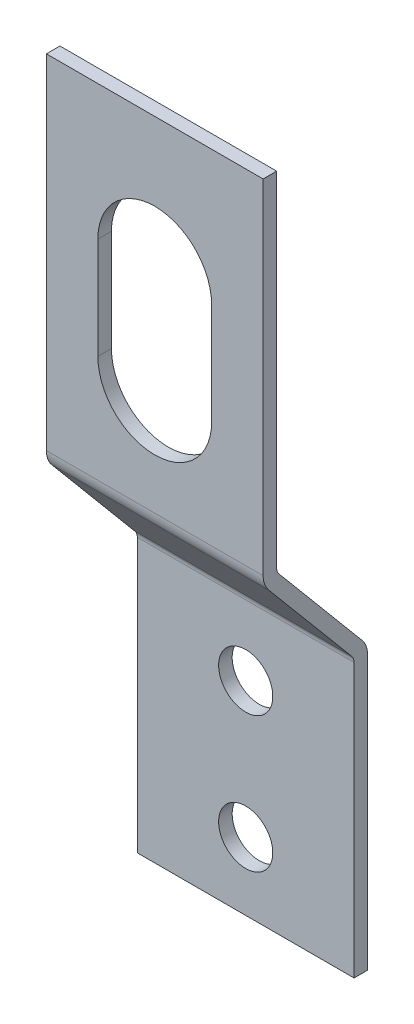
ISO-10303-21;
HEADER;
FILE_DESCRIPTION(('STEP AP214'),'2;1');
FILE_NAME('part.step','',(''),(''),'','','');
FILE_SCHEMA(('AUTOMOTIVE_DESIGN { 1 0 10303 214 1 1 1 1 }'));
ENDSEC;
DATA;
#1=APPLICATION_CONTEXT('core data for automotive mechanical design processes');
#2=APPLICATION_PROTOCOL_DEFINITION('international standard','automotive_design',2000,#1);
#3=PRODUCT_CONTEXT('',#1,'mechanical');
#4=PRODUCT('Part','Part','',(#3));
#5=PRODUCT_RELATED_PRODUCT_CATEGORY('part','',(#4));
#6=PRODUCT_DEFINITION_FORMATION('','',#4);
#7=PRODUCT_DEFINITION_CONTEXT('part definition',#1,'design');
#8=PRODUCT_DEFINITION('design','',#6,#7);
#9=PRODUCT_DEFINITION_SHAPE('','',#8);
#10=(LENGTH_UNIT() NAMED_UNIT(*) SI_UNIT(.MILLI.,.METRE.));
#11=(NAMED_UNIT(*) PLANE_ANGLE_UNIT() SI_UNIT($,.RADIAN.));
#12=(NAMED_UNIT(*) SI_UNIT($,.STERADIAN.) SOLID_ANGLE_UNIT());
#13=UNCERTAINTY_MEASURE_WITH_UNIT(LENGTH_MEASURE(1.E-05),#10,'distance_accuracy_value','');
#14=(GEOMETRIC_REPRESENTATION_CONTEXT(3) GLOBAL_UNCERTAINTY_ASSIGNED_CONTEXT((#13)) GLOBAL_UNIT_ASSIGNED_CONTEXT((#10,
#11,#12)) REPRESENTATION_CONTEXT('',''));
#15=CARTESIAN_POINT('',(0.,0.,0.));
#16=DIRECTION('',(0.,0.,1.));
#17=DIRECTION('',(1.,0.,0.));
#18=AXIS2_PLACEMENT_3D('',#15,#16,#17);
#19=CARTESIAN_POINT('',(0.,-1.19175359259422,6.71345131623842));
#20=DIRECTION('',(0.,0.,-1.));
#21=DIRECTION('',(-1.,0.,0.));
#22=AXIS2_PLACEMENT_3D('',#19,#20,#21);
#23=PLANE('',#22);
#24=DIRECTION('',(0.,-1.,0.));
#25=VECTOR('',#24,1.);
#26=CARTESIAN_POINT('',(8.,54.4450558979731,6.71345131623842));
#27=LINE('',#26,#25);
#28=CARTESIAN_POINT('',(8.,29.0771266067998,6.71345131623842));
#29=VERTEX_POINT('',#28);
#30=CARTESIAN_POINT('',(8.,54.4450558979731,6.71345131623842));
#31=VERTEX_POINT('',#30);
#32=EDGE_CURVE('E153',#29,#31,#27,.F.);
#33=ORIENTED_EDGE('',*,*,#32,.T.);
#34=DIRECTION('',(1.,0.,0.));
#35=VECTOR('',#34,1.);
#36=CARTESIAN_POINT('',(-8.,54.4450558979731,6.71345131623842));
#37=LINE('',#36,#35);
#38=CARTESIAN_POINT('',(-8.,54.4450558979731,6.71345131623842));
#39=VERTEX_POINT('',#38);
#40=EDGE_CURVE('E163',#31,#39,#37,.F.);
#41=ORIENTED_EDGE('',*,*,#40,.T.);
#42=DIRECTION('',(0.,1.,0.));
#43=VECTOR('',#42,1.);
#44=CARTESIAN_POINT('',(-8.,28.8090261322393,6.71345131623842));
#45=LINE('',#44,#43);
#46=CARTESIAN_POINT('',(-8.,29.0771266067998,6.71345131623842));
#47=VERTEX_POINT('',#46);
#48=EDGE_CURVE('E155',#39,#47,#45,.F.);
#49=ORIENTED_EDGE('',*,*,#48,.T.);
#50=DIRECTION('',(1.,0.,0.));
#51=VECTOR('',#50,1.);
#52=CARTESIAN_POINT('',(8.00000000000001,29.0771266067998,6.71345131623842));
#53=LINE('',#52,#51);
#54=EDGE_CURVE('E219',#29,#47,#53,.F.);
#55=ORIENTED_EDGE('',*,*,#54,.F.);
#56=EDGE_LOOP('',(#33,#41,#49,#55));
#57=FACE_BOUND('',#56,.T.);
#58=CARTESIAN_POINT('',(0.,44.5,6.71345131623842));
#59=DIRECTION('',(0.,0.,-1.));
#60=DIRECTION('',(-1.,0.,0.));
#61=AXIS2_PLACEMENT_3D('',#58,#59,#60);
#62=CIRCLE('',#61,4.2);
#63=CARTESIAN_POINT('',(-4.2,44.5,6.71345131623842));
#64=VERTEX_POINT('',#63);
#65=CARTESIAN_POINT('',(4.2,44.5,6.71345131623842));
#66=VERTEX_POINT('',#65);
#67=EDGE_CURVE('E20',#64,#66,#62,.T.);
#68=ORIENTED_EDGE('',*,*,#67,.T.);
#69=DIRECTION('',(0.,1.,0.));
#70=VECTOR('',#69,1.);
#71=CARTESIAN_POINT('',(4.2,44.5,6.71345131623842));
#72=LINE('',#71,#70);
#73=CARTESIAN_POINT('',(4.2,37.,6.71345131623842));
#74=VERTEX_POINT('',#73);
#75=EDGE_CURVE('E168',#66,#74,#72,.F.);
#76=ORIENTED_EDGE('',*,*,#75,.T.);
#77=CARTESIAN_POINT('',(0.,37.,6.71345131623842));
#78=DIRECTION('',(0.,0.,-1.));
#79=DIRECTION('',(-1.,0.,0.));
#80=AXIS2_PLACEMENT_3D('',#77,#78,#79);
#81=CIRCLE('',#80,4.2);
#82=CARTESIAN_POINT('',(-4.2,37.,6.71345131623842));
#83=VERTEX_POINT('',#82);
#84=EDGE_CURVE('E132',#74,#83,#81,.T.);
#85=ORIENTED_EDGE('',*,*,#84,.T.);
#86=DIRECTION('',(0.,-1.,0.));
#87=VECTOR('',#86,1.);
#88=CARTESIAN_POINT('',(-4.2,44.5,6.71345131623842));
#89=LINE('',#88,#87);
#90=EDGE_CURVE('E128',#83,#64,#89,.F.);
#91=ORIENTED_EDGE('',*,*,#90,.T.);
#92=EDGE_LOOP('',(#68,#76,#85,#91));
#93=FACE_BOUND('',#92,.T.);
#94=ADVANCED_FACE('F17',(#57,#93),#23,.F.);
#95=CARTESIAN_POINT('',(0.,44.5,6.71345131623842));
#96=DIRECTION('',(0.,0.,-1.));
#97=DIRECTION('',(-1.,0.,0.));
#98=AXIS2_PLACEMENT_3D('',#95,#96,#97);
#99=CYLINDRICAL_SURFACE('',#98,4.2);
#100=DIRECTION('',(0.,0.,1.));
#101=VECTOR('',#100,1.);
#102=CARTESIAN_POINT('',(4.2,44.5,6.71345131623842));
#103=LINE('',#102,#101);
#104=CARTESIAN_POINT('',(4.2,44.5,5.71345131623842));
#105=VERTEX_POINT('',#104);
#106=EDGE_CURVE('E142',#105,#66,#103,.T.);
#107=ORIENTED_EDGE('',*,*,#106,.T.);
#108=ORIENTED_EDGE('',*,*,#67,.F.);
#109=DIRECTION('',(0.,0.,1.));
#110=VECTOR('',#109,1.);
#111=CARTESIAN_POINT('',(-4.2,44.5,6.71345131623842));
#112=LINE('',#111,#110);
#113=CARTESIAN_POINT('',(-4.2,44.5,5.71345131623842));
#114=VERTEX_POINT('',#113);
#115=EDGE_CURVE('E136',#64,#114,#112,.F.);
#116=ORIENTED_EDGE('',*,*,#115,.T.);
#117=CARTESIAN_POINT('',(0.,44.5,5.71345131623842));
#118=DIRECTION('',(0.,0.,-1.));
#119=DIRECTION('',(-1.,0.,0.));
#120=AXIS2_PLACEMENT_3D('',#117,#118,#119);
#121=CIRCLE('',#120,4.2);
#122=EDGE_CURVE('E215',#105,#114,#121,.F.);
#123=ORIENTED_EDGE('',*,*,#122,.F.);
#124=EDGE_LOOP('',(#107,#108,#116,#123));
#125=FACE_BOUND('',#124,.T.);
#126=ADVANCED_FACE('F139',(#125),#99,.F.);
#127=CARTESIAN_POINT('',(-4.2,44.5,6.71345131623842));
#128=DIRECTION('',(-1.,0.,0.));
#129=DIRECTION('',(0.,-1.,0.));
#130=AXIS2_PLACEMENT_3D('',#127,#128,#129);
#131=PLANE('',#130);
#132=ORIENTED_EDGE('',*,*,#115,.F.);
#133=ORIENTED_EDGE('',*,*,#90,.F.);
#134=DIRECTION('',(0.,0.,-1.));
#135=VECTOR('',#134,1.);
#136=CARTESIAN_POINT('',(-4.2,37.,6.71345131623842));
#137=LINE('',#136,#135);
#138=CARTESIAN_POINT('',(-4.2,37.,5.71345131623842));
#139=VERTEX_POINT('',#138);
#140=EDGE_CURVE('E149',#83,#139,#137,.T.);
#141=ORIENTED_EDGE('',*,*,#140,.T.);
#142=DIRECTION('',(0.,1.,0.));
#143=VECTOR('',#142,1.);
#144=CARTESIAN_POINT('',(-4.2,-1.19175359259422,5.71345131623842));
#145=LINE('',#144,#143);
#146=EDGE_CURVE('E146',#114,#139,#145,.F.);
#147=ORIENTED_EDGE('',*,*,#146,.F.);
#148=EDGE_LOOP('',(#132,#133,#141,#147));
#149=FACE_BOUND('',#148,.T.);
#150=ADVANCED_FACE('F144',(#149),#131,.F.);
#151=CARTESIAN_POINT('',(0.,37.,6.71345131623842));
#152=DIRECTION('',(0.,0.,-1.));
#153=DIRECTION('',(-1.,0.,0.));
#154=AXIS2_PLACEMENT_3D('',#151,#152,#153);
#155=CYLINDRICAL_SURFACE('',#154,4.2);
#156=ORIENTED_EDGE('',*,*,#140,.F.);
#157=ORIENTED_EDGE('',*,*,#84,.F.);
#158=DIRECTION('',(0.,0.,1.));
#159=VECTOR('',#158,1.);
#160=CARTESIAN_POINT('',(4.2,37.,6.71345131623842));
#161=LINE('',#160,#159);
#162=CARTESIAN_POINT('',(4.2,37.,5.71345131623842));
#163=VERTEX_POINT('',#162);
#164=EDGE_CURVE('E156',#74,#163,#161,.F.);
#165=ORIENTED_EDGE('',*,*,#164,.T.);
#166=CARTESIAN_POINT('',(0.,37.,5.71345131623842));
#167=DIRECTION('',(0.,0.,-1.));
#168=DIRECTION('',(-1.,0.,0.));
#169=AXIS2_PLACEMENT_3D('',#166,#167,#168);
#170=CIRCLE('',#169,4.2);
#171=EDGE_CURVE('E211',#139,#163,#170,.F.);
#172=ORIENTED_EDGE('',*,*,#171,.F.);
#173=EDGE_LOOP('',(#156,#157,#165,#172));
#174=FACE_BOUND('',#173,.T.);
#175=ADVANCED_FACE('F242',(#174),#155,.F.);
#176=CARTESIAN_POINT('',(4.2,44.5,6.71345131623842));
#177=DIRECTION('',(1.,0.,0.));
#178=DIRECTION('',(0.,1.,0.));
#179=AXIS2_PLACEMENT_3D('',#176,#177,#178);
#180=PLANE('',#179);
#181=ORIENTED_EDGE('',*,*,#164,.F.);
#182=ORIENTED_EDGE('',*,*,#75,.F.);
#183=ORIENTED_EDGE('',*,*,#106,.F.);
#184=DIRECTION('',(0.,1.,0.));
#185=VECTOR('',#184,1.);
#186=CARTESIAN_POINT('',(4.2,-1.19175359259422,5.71345131623842));
#187=LINE('',#186,#185);
#188=EDGE_CURVE('E214',#163,#105,#187,.T.);
#189=ORIENTED_EDGE('',*,*,#188,.F.);
#190=EDGE_LOOP('',(#181,#182,#183,#189));
#191=FACE_BOUND('',#190,.T.);
#192=ADVANCED_FACE('F464',(#191),#180,.F.);
#193=CARTESIAN_POINT('',(-8.,54.4450558979731,6.71345131623842));
#194=DIRECTION('',(0.,-1.,0.));
#195=DIRECTION('',(0.,0.,-1.));
#196=AXIS2_PLACEMENT_3D('',#193,#194,#195);
#197=PLANE('',#196);
#198=DIRECTION('',(0.,0.,-1.));
#199=VECTOR('',#198,1.);
#200=CARTESIAN_POINT('',(-8.,54.4450558979731,6.71345131623842));
#201=LINE('',#200,#199);
#202=CARTESIAN_POINT('',(-8.,54.4450558979731,5.71345131623842));
#203=VERTEX_POINT('',#202);
#204=EDGE_CURVE('E165',#39,#203,#201,.T.);
#205=ORIENTED_EDGE('',*,*,#204,.F.);
#206=ORIENTED_EDGE('',*,*,#40,.F.);
#207=DIRECTION('',(0.,0.,-1.));
#208=VECTOR('',#207,1.);
#209=CARTESIAN_POINT('',(8.,54.4450558979731,6.71345131623842));
#210=LINE('',#209,#208);
#211=CARTESIAN_POINT('',(8.,54.4450558979731,5.71345131623842));
#212=VERTEX_POINT('',#211);
#213=EDGE_CURVE('E160',#212,#31,#210,.F.);
#214=ORIENTED_EDGE('',*,*,#213,.F.);
#215=DIRECTION('',(-1.,0.,0.));
#216=VECTOR('',#215,1.);
#217=CARTESIAN_POINT('',(0.,54.4450558979731,5.71345131623842));
#218=LINE('',#217,#216);
#219=EDGE_CURVE('E210',#203,#212,#218,.F.);
#220=ORIENTED_EDGE('',*,*,#219,.F.);
#221=EDGE_LOOP('',(#205,#206,#214,#220));
#222=FACE_BOUND('',#221,.T.);
#223=ADVANCED_FACE('F290',(#222),#197,.F.);
#224=CARTESIAN_POINT('',(8.00000000000001,29.0771266067998,4.97685131623841));
#225=DIRECTION('',(1.,0.,0.));
#226=DIRECTION('',(0.,0.,-1.));
#227=AXIS2_PLACEMENT_3D('',#224,#225,#226);
#228=CYLINDRICAL_SURFACE('',#227,1.7366);
#229=ORIENTED_EDGE('',*,*,#54,.T.);
#230=CARTESIAN_POINT('',(-8.,29.0771266067998,4.97685131623841));
#231=DIRECTION('',(1.,0.,0.));
#232=DIRECTION('',(0.,0.,-1.));
#233=AXIS2_PLACEMENT_3D('',#230,#231,#232);
#234=CIRCLE('',#233,1.7366);
#235=CARTESIAN_POINT('',(-8.,27.9608616438182,6.30716409615884));
#236=VERTEX_POINT('',#235);
#237=EDGE_CURVE('E206',#236,#47,#234,.F.);
#238=ORIENTED_EDGE('',*,*,#237,.F.);
#239=DIRECTION('',(1.,0.,0.));
#240=VECTOR('',#239,1.);
#241=CARTESIAN_POINT('',(0.,27.9608616438182,6.30716409615885));
#242=LINE('',#241,#240);
#243=CARTESIAN_POINT('',(8.,27.9608616438182,6.30716409615884));
#244=VERTEX_POINT('',#243);
#245=EDGE_CURVE('E209',#244,#236,#242,.F.);
#246=ORIENTED_EDGE('',*,*,#245,.F.);
#247=CARTESIAN_POINT('',(8.,29.0771266067998,4.97685131623841));
#248=DIRECTION('',(1.,0.,0.));
#249=DIRECTION('',(0.,0.,-1.));
#250=AXIS2_PLACEMENT_3D('',#247,#248,#249);
#251=CIRCLE('',#250,1.7366);
#252=EDGE_CURVE('E217',#244,#29,#251,.F.);
#253=ORIENTED_EDGE('',*,*,#252,.T.);
#254=EDGE_LOOP('',(#229,#238,#246,#253));
#255=FACE_BOUND('',#254,.T.);
#256=ADVANCED_FACE('F447',(#255),#228,.T.);
#257=CARTESIAN_POINT('',(0.,-1.19175359259422,5.71345131623842));
#258=DIRECTION('',(0.,0.,-1.));
#259=DIRECTION('',(-1.,0.,0.));
#260=AXIS2_PLACEMENT_3D('',#257,#258,#259);
#261=PLANE('',#260);
#262=DIRECTION('',(0.,1.,0.));
#263=VECTOR('',#262,1.);
#264=CARTESIAN_POINT('',(-8.,-1.19175359259422,5.71345131623842));
#265=LINE('',#264,#263);
#266=CARTESIAN_POINT('',(-8.,29.0771266067998,5.71345131623842));
#267=VERTEX_POINT('',#266);
#268=EDGE_CURVE('E231',#267,#203,#265,.T.);
#269=ORIENTED_EDGE('',*,*,#268,.T.);
#270=ORIENTED_EDGE('',*,*,#219,.T.);
#271=DIRECTION('',(0.,1.,0.));
#272=VECTOR('',#271,1.);
#273=CARTESIAN_POINT('',(8.,-1.19175359259422,5.71345131623842));
#274=LINE('',#273,#272);
#275=CARTESIAN_POINT('',(8.,29.0771266067998,5.71345131623842));
#276=VERTEX_POINT('',#275);
#277=EDGE_CURVE('E254',#212,#276,#274,.F.);
#278=ORIENTED_EDGE('',*,*,#277,.T.);
#279=DIRECTION('',(1.,0.,0.));
#280=VECTOR('',#279,1.);
#281=CARTESIAN_POINT('',(8.00000000000001,29.0771266067998,5.71345131623842));
#282=LINE('',#281,#280);
#283=EDGE_CURVE('E202',#276,#267,#282,.F.);
#284=ORIENTED_EDGE('',*,*,#283,.T.);
#285=EDGE_LOOP('',(#269,#270,#278,#284));
#286=FACE_BOUND('',#285,.T.);
#287=ORIENTED_EDGE('',*,*,#171,.T.);
#288=ORIENTED_EDGE('',*,*,#188,.T.);
#289=ORIENTED_EDGE('',*,*,#122,.T.);
#290=ORIENTED_EDGE('',*,*,#146,.T.);
#291=EDGE_LOOP('',(#287,#288,#289,#290));
#292=FACE_BOUND('',#291,.T.);
#293=ADVANCED_FACE('F247',(#286,#292),#261,.T.);
#294=CARTESIAN_POINT('',(0.,7.53414621880322,-10.8328852831343));
#295=DIRECTION('',(0.,-0.642787609686535,0.766044443118982));
#296=DIRECTION('',(0.,-0.766044443118982,-0.642787609686535));
#297=AXIS2_PLACEMENT_3D('',#294,#295,#296);
#298=PLANE('',#297);
#299=DIRECTION('',(0.,-0.766044443118982,-0.642787609686535));
#300=VECTOR('',#299,1.);
#301=CARTESIAN_POINT('',(-8.,27.9608616438182,6.30716409615884));
#302=LINE('',#301,#300);
#303=CARTESIAN_POINT('',(-8.,20.6496530518742,0.172331663198554));
#304=VERTEX_POINT('',#303);
#305=EDGE_CURVE('E261',#236,#304,#302,.T.);
#306=ORIENTED_EDGE('',*,*,#305,.T.);
#307=DIRECTION('',(-1.,0.,0.));
#308=VECTOR('',#307,1.);
#309=CARTESIAN_POINT('',(-8.,20.6496530518742,0.172331663198554));
#310=LINE('',#309,#308);
#311=CARTESIAN_POINT('',(8.,20.6496530518742,0.172331663198554));
#312=VERTEX_POINT('',#311);
#313=EDGE_CURVE('E199',#304,#312,#310,.F.);
#314=ORIENTED_EDGE('',*,*,#313,.T.);
#315=DIRECTION('',(0.,0.766044443118982,0.642787609686534));
#316=VECTOR('',#315,1.);
#317=CARTESIAN_POINT('',(8.,20.6496530518742,0.172331663198555));
#318=LINE('',#317,#316);
#319=EDGE_CURVE('E205',#312,#244,#318,.T.);
#320=ORIENTED_EDGE('',*,*,#319,.T.);
#321=ORIENTED_EDGE('',*,*,#245,.T.);
#322=EDGE_LOOP('',(#306,#314,#320,#321));
#323=FACE_BOUND('',#322,.T.);
#324=ADVANCED_FACE('F317',(#323),#298,.T.);
#325=CARTESIAN_POINT('',(8.00000000000001,29.0771266067998,4.97685131623841));
#326=DIRECTION('',(1.,0.,0.));
#327=DIRECTION('',(0.,0.,-1.));
#328=AXIS2_PLACEMENT_3D('',#325,#326,#327);
#329=CYLINDRICAL_SURFACE('',#328,0.736600000000001);
#330=CARTESIAN_POINT('',(-8.,29.0771266067998,4.97685131623841));
#331=DIRECTION('',(1.,0.,0.));
#332=DIRECTION('',(0.,0.,-1.));
#333=AXIS2_PLACEMENT_3D('',#330,#331,#332);
#334=CIRCLE('',#333,0.736600000000001);
#335=CARTESIAN_POINT('',(-8.,28.6036492535047,5.54111965303987));
#336=VERTEX_POINT('',#335);
#337=EDGE_CURVE('E200',#267,#336,#334,.T.);
#338=ORIENTED_EDGE('',*,*,#337,.F.);
#339=ORIENTED_EDGE('',*,*,#283,.F.);
#340=CARTESIAN_POINT('',(8.,29.0771266067998,4.97685131623841));
#341=DIRECTION('',(1.,0.,0.));
#342=DIRECTION('',(0.,0.,-1.));
#343=AXIS2_PLACEMENT_3D('',#340,#341,#342);
#344=CIRCLE('',#343,0.736600000000001);
#345=CARTESIAN_POINT('',(8.,28.6036492535047,5.54111965303986));
#346=VERTEX_POINT('',#345);
#347=EDGE_CURVE('E203',#346,#276,#344,.F.);
#348=ORIENTED_EDGE('',*,*,#347,.F.);
#349=DIRECTION('',(1.,0.,0.));
#350=VECTOR('',#349,1.);
#351=CARTESIAN_POINT('',(0.,28.6036492535047,5.54111965303987));
#352=LINE('',#351,#350);
#353=EDGE_CURVE('E195',#346,#336,#352,.F.);
#354=ORIENTED_EDGE('',*,*,#353,.T.);
#355=EDGE_LOOP('',(#338,#339,#348,#354));
#356=FACE_BOUND('',#355,.T.);
#357=ADVANCED_FACE('F278',(#356),#329,.F.);
#358=CARTESIAN_POINT('',(-8.,20.1761756985791,0.736599999999996));
#359=DIRECTION('',(-1.,0.,0.));
#360=DIRECTION('',(0.,0.,1.));
#361=AXIS2_PLACEMENT_3D('',#358,#359,#360);
#362=CYLINDRICAL_SURFACE('',#361,0.736599999999999);
#363=CARTESIAN_POINT('',(8.,20.1761756985791,0.736599999999996));
#364=DIRECTION('',(-1.,0.,0.));
#365=DIRECTION('',(0.,0.,1.));
#366=AXIS2_PLACEMENT_3D('',#363,#364,#365);
#367=CIRCLE('',#366,0.736599999999999);
#368=CARTESIAN_POINT('',(8.,20.1761756985791,0.));
#369=VERTEX_POINT('',#368);
#370=EDGE_CURVE('E192',#312,#369,#367,.T.);
#371=ORIENTED_EDGE('',*,*,#370,.F.);
#372=ORIENTED_EDGE('',*,*,#313,.F.);
#373=CARTESIAN_POINT('',(-8.,20.1761756985791,0.736599999999996));
#374=DIRECTION('',(-1.,0.,0.));
#375=DIRECTION('',(0.,0.,1.));
#376=AXIS2_PLACEMENT_3D('',#373,#374,#375);
#377=CIRCLE('',#376,0.736599999999999);
#378=CARTESIAN_POINT('',(-8.,20.1761756985791,0.));
#379=VERTEX_POINT('',#378);
#380=EDGE_CURVE('E196',#304,#379,#377,.T.);
#381=ORIENTED_EDGE('',*,*,#380,.T.);
#382=DIRECTION('',(-1.,0.,0.));
#383=VECTOR('',#382,1.);
#384=CARTESIAN_POINT('',(0.,20.1761756985791,0.));
#385=LINE('',#384,#383);
#386=EDGE_CURVE('E191',#379,#369,#385,.F.);
#387=ORIENTED_EDGE('',*,*,#386,.T.);
#388=EDGE_LOOP('',(#371,#372,#381,#387));
#389=FACE_BOUND('',#388,.T.);
#390=ADVANCED_FACE('F328',(#389),#362,.F.);
#391=CARTESIAN_POINT('',(0.,8.17693382848976,-11.5989297262533));
#392=DIRECTION('',(0.,-0.642787609686535,0.766044443118982));
#393=DIRECTION('',(0.,-0.766044443118982,-0.642787609686535));
#394=AXIS2_PLACEMENT_3D('',#391,#392,#393);
#395=PLANE('',#394);
#396=DIRECTION('',(0.,-0.766044443118982,-0.642787609686535));
#397=VECTOR('',#396,1.);
#398=CARTESIAN_POINT('',(8.,8.17693382848976,-11.5989297262533));
#399=LINE('',#398,#397);
#400=CARTESIAN_POINT('',(8.,21.2924406615607,-0.593712779920426));
#401=VERTEX_POINT('',#400);
#402=EDGE_CURVE('E293',#401,#346,#399,.F.);
#403=ORIENTED_EDGE('',*,*,#402,.F.);
#404=DIRECTION('',(-1.,0.,0.));
#405=VECTOR('',#404,1.);
#406=CARTESIAN_POINT('',(-8.,21.2924406615607,-0.593712779920429));
#407=LINE('',#406,#405);
#408=CARTESIAN_POINT('',(-8.,21.2924406615607,-0.593712779920428));
#409=VERTEX_POINT('',#408);
#410=EDGE_CURVE('E180',#409,#401,#407,.F.);
#411=ORIENTED_EDGE('',*,*,#410,.F.);
#412=DIRECTION('',(0.,-0.766044443118982,-0.642787609686535));
#413=VECTOR('',#412,1.);
#414=CARTESIAN_POINT('',(-8.00000000000001,8.17693382848976,-11.5989297262533));
#415=LINE('',#414,#413);
#416=EDGE_CURVE('E198',#336,#409,#415,.T.);
#417=ORIENTED_EDGE('',*,*,#416,.F.);
#418=ORIENTED_EDGE('',*,*,#353,.F.);
#419=EDGE_LOOP('',(#403,#411,#417,#418));
#420=FACE_BOUND('',#419,.T.);
#421=ADVANCED_FACE('F295',(#420),#395,.F.);
#422=CARTESIAN_POINT('',(0.,0.,0.));
#423=DIRECTION('',(0.,0.,-1.));
#424=DIRECTION('',(-1.,0.,0.));
#425=AXIS2_PLACEMENT_3D('',#422,#423,#424);
#426=PLANE('',#425);
#427=DIRECTION('',(0.,-1.,0.));
#428=VECTOR('',#427,1.);
#429=CARTESIAN_POINT('',(-8.,0.,0.));
#430=LINE('',#429,#428);
#431=CARTESIAN_POINT('',(-8.,0.,0.));
#432=VERTEX_POINT('',#431);
#433=EDGE_CURVE('E184',#432,#379,#430,.F.);
#434=ORIENTED_EDGE('',*,*,#433,.F.);
#435=DIRECTION('',(1.,0.,0.));
#436=VECTOR('',#435,1.);
#437=CARTESIAN_POINT('',(-8.,0.,0.));
#438=LINE('',#437,#436);
#439=CARTESIAN_POINT('',(8.,0.,0.));
#440=VERTEX_POINT('',#439);
#441=EDGE_CURVE('E311',#440,#432,#438,.F.);
#442=ORIENTED_EDGE('',*,*,#441,.F.);
#443=DIRECTION('',(0.,1.,0.));
#444=VECTOR('',#443,1.);
#445=CARTESIAN_POINT('',(8.,0.,0.));
#446=LINE('',#445,#444);
#447=EDGE_CURVE('E179',#369,#440,#446,.F.);
#448=ORIENTED_EDGE('',*,*,#447,.F.);
#449=ORIENTED_EDGE('',*,*,#386,.F.);
#450=EDGE_LOOP('',(#434,#442,#448,#449));
#451=FACE_BOUND('',#450,.T.);
#452=CARTESIAN_POINT('',(0.,5.,0.));
#453=DIRECTION('',(0.,0.,-1.));
#454=DIRECTION('',(-1.,0.,0.));
#455=AXIS2_PLACEMENT_3D('',#452,#453,#454);
#456=CIRCLE('',#455,2.);
#457=CARTESIAN_POINT('',(-2.,5.,0.));
#458=VERTEX_POINT('',#457);
#459=EDGE_CURVE('E185',#458,#458,#456,.T.);
#460=ORIENTED_EDGE('',*,*,#459,.T.);
#461=EDGE_LOOP('',(#460));
#462=FACE_BOUND('',#461,.T.);
#463=CARTESIAN_POINT('',(0.,15.,0.));
#464=DIRECTION('',(0.,0.,-1.));
#465=DIRECTION('',(-1.,0.,0.));
#466=AXIS2_PLACEMENT_3D('',#463,#464,#465);
#467=CIRCLE('',#466,2.);
#468=CARTESIAN_POINT('',(-2.,15.,0.));
#469=VERTEX_POINT('',#468);
#470=EDGE_CURVE('E188',#469,#469,#467,.T.);
#471=ORIENTED_EDGE('',*,*,#470,.T.);
#472=EDGE_LOOP('',(#471));
#473=FACE_BOUND('',#472,.T.);
#474=ADVANCED_FACE('F323',(#451,#462,#473),#426,.F.);
#475=CARTESIAN_POINT('',(0.,15.,6.71345131623842));
#476=DIRECTION('',(0.,0.,-1.));
#477=DIRECTION('',(-1.,0.,0.));
#478=AXIS2_PLACEMENT_3D('',#475,#476,#477);
#479=CYLINDRICAL_SURFACE('',#478,2.);
#480=CARTESIAN_POINT('',(0.,15.,-1.));
#481=DIRECTION('',(0.,0.,-1.));
#482=DIRECTION('',(-1.,0.,0.));
#483=AXIS2_PLACEMENT_3D('',#480,#481,#482);
#484=CIRCLE('',#483,2.);
#485=CARTESIAN_POINT('',(-2.,15.,-1.));
#486=VERTEX_POINT('',#485);
#487=EDGE_CURVE('E174',#486,#486,#484,.F.);
#488=ORIENTED_EDGE('',*,*,#487,.F.);
#489=EDGE_LOOP('',(#488));
#490=FACE_BOUND('',#489,.T.);
#491=ORIENTED_EDGE('',*,*,#470,.F.);
#492=EDGE_LOOP('',(#491));
#493=FACE_BOUND('',#492,.T.);
#494=ADVANCED_FACE('F388',(#490,#493),#479,.F.);
#495=CARTESIAN_POINT('',(0.,5.,6.71345131623842));
#496=DIRECTION('',(0.,0.,-1.));
#497=DIRECTION('',(-1.,0.,0.));
#498=AXIS2_PLACEMENT_3D('',#495,#496,#497);
#499=CYLINDRICAL_SURFACE('',#498,2.);
#500=CARTESIAN_POINT('',(0.,5.,-1.));
#501=DIRECTION('',(0.,0.,-1.));
#502=DIRECTION('',(-1.,0.,0.));
#503=AXIS2_PLACEMENT_3D('',#500,#501,#502);
#504=CIRCLE('',#503,2.);
#505=CARTESIAN_POINT('',(-2.,5.,-1.));
#506=VERTEX_POINT('',#505);
#507=EDGE_CURVE('E170',#506,#506,#504,.F.);
#508=ORIENTED_EDGE('',*,*,#507,.F.);
#509=EDGE_LOOP('',(#508));
#510=FACE_BOUND('',#509,.T.);
#511=ORIENTED_EDGE('',*,*,#459,.F.);
#512=EDGE_LOOP('',(#511));
#513=FACE_BOUND('',#512,.T.);
#514=ADVANCED_FACE('F350',(#510,#513),#499,.F.);
#515=CARTESIAN_POINT('',(-8.,0.,-1.));
#516=DIRECTION('',(-1.,0.,0.));
#517=DIRECTION('',(0.,-1.,0.));
#518=AXIS2_PLACEMENT_3D('',#515,#516,#517);
#519=PLANE('',#518);
#520=DIRECTION('',(0.,1.,0.));
#521=VECTOR('',#520,1.);
#522=CARTESIAN_POINT('',(-8.,0.,-1.));
#523=LINE('',#522,#521);
#524=CARTESIAN_POINT('',(-8.,0.,-1.));
#525=VERTEX_POINT('',#524);
#526=CARTESIAN_POINT('',(-8.,20.1761756985791,-1.));
#527=VERTEX_POINT('',#526);
#528=EDGE_CURVE('E173',#525,#527,#523,.T.);
#529=ORIENTED_EDGE('',*,*,#528,.F.);
#530=DIRECTION('',(0.,0.,-1.));
#531=VECTOR('',#530,1.);
#532=CARTESIAN_POINT('',(-8.,0.,-1.));
#533=LINE('',#532,#531);
#534=EDGE_CURVE('E308',#432,#525,#533,.T.);
#535=ORIENTED_EDGE('',*,*,#534,.F.);
#536=ORIENTED_EDGE('',*,*,#433,.T.);
#537=ORIENTED_EDGE('',*,*,#380,.F.);
#538=ORIENTED_EDGE('',*,*,#305,.F.);
#539=ORIENTED_EDGE('',*,*,#237,.T.);
#540=ORIENTED_EDGE('',*,*,#48,.F.);
#541=ORIENTED_EDGE('',*,*,#204,.T.);
#542=ORIENTED_EDGE('',*,*,#268,.F.);
#543=ORIENTED_EDGE('',*,*,#337,.T.);
#544=ORIENTED_EDGE('',*,*,#416,.T.);
#545=CARTESIAN_POINT('',(-8.,20.1761756985791,0.736599999999996));
#546=DIRECTION('',(-1.,0.,0.));
#547=DIRECTION('',(0.,0.,1.));
#548=AXIS2_PLACEMENT_3D('',#545,#546,#547);
#549=CIRCLE('',#548,1.7366);
#550=EDGE_CURVE('E181',#527,#409,#549,.F.);
#551=ORIENTED_EDGE('',*,*,#550,.F.);
#552=EDGE_LOOP('',(#529,#535,#536,#537,#538,#539,#540,#541,#542,#543,#544,#551));
#553=FACE_BOUND('',#552,.T.);
#554=ADVANCED_FACE('F282',(#553),#519,.T.);
#555=CARTESIAN_POINT('',(-8.,20.1761756985791,0.736599999999996));
#556=DIRECTION('',(-1.,0.,0.));
#557=DIRECTION('',(0.,0.,1.));
#558=AXIS2_PLACEMENT_3D('',#555,#556,#557);
#559=CYLINDRICAL_SURFACE('',#558,1.7366);
#560=ORIENTED_EDGE('',*,*,#410,.T.);
#561=CARTESIAN_POINT('',(8.,20.1761756985791,0.736599999999996));
#562=DIRECTION('',(-1.,0.,0.));
#563=DIRECTION('',(0.,0.,1.));
#564=AXIS2_PLACEMENT_3D('',#561,#562,#563);
#565=CIRCLE('',#564,1.7366);
#566=CARTESIAN_POINT('',(8.,20.1761756985791,-1.));
#567=VERTEX_POINT('',#566);
#568=EDGE_CURVE('E177',#401,#567,#565,.T.);
#569=ORIENTED_EDGE('',*,*,#568,.T.);
#570=DIRECTION('',(-1.,0.,0.));
#571=VECTOR('',#570,1.);
#572=CARTESIAN_POINT('',(0.,20.1761756985791,-1.));
#573=LINE('',#572,#571);
#574=EDGE_CURVE('E303',#527,#567,#573,.F.);
#575=ORIENTED_EDGE('',*,*,#574,.F.);
#576=ORIENTED_EDGE('',*,*,#550,.T.);
#577=EDGE_LOOP('',(#560,#569,#575,#576));
#578=FACE_BOUND('',#577,.T.);
#579=ADVANCED_FACE('F341',(#578),#559,.T.);
#580=CARTESIAN_POINT('',(8.,0.,-1.));
#581=DIRECTION('',(1.,0.,0.));
#582=DIRECTION('',(0.,1.,0.));
#583=AXIS2_PLACEMENT_3D('',#580,#581,#582);
#584=PLANE('',#583);
#585=DIRECTION('',(0.,0.,-1.));
#586=VECTOR('',#585,1.);
#587=CARTESIAN_POINT('',(8.,0.,-1.));
#588=LINE('',#587,#586);
#589=CARTESIAN_POINT('',(8.,0.,-1.));
#590=VERTEX_POINT('',#589);
#591=EDGE_CURVE('E35',#590,#440,#588,.F.);
#592=ORIENTED_EDGE('',*,*,#591,.F.);
#593=DIRECTION('',(0.,1.,0.));
#594=VECTOR('',#593,1.);
#595=CARTESIAN_POINT('',(8.,0.,-1.));
#596=LINE('',#595,#594);
#597=EDGE_CURVE('E26',#567,#590,#596,.F.);
#598=ORIENTED_EDGE('',*,*,#597,.F.);
#599=ORIENTED_EDGE('',*,*,#568,.F.);
#600=ORIENTED_EDGE('',*,*,#402,.T.);
#601=ORIENTED_EDGE('',*,*,#347,.T.);
#602=ORIENTED_EDGE('',*,*,#277,.F.);
#603=ORIENTED_EDGE('',*,*,#213,.T.);
#604=ORIENTED_EDGE('',*,*,#32,.F.);
#605=ORIENTED_EDGE('',*,*,#252,.F.);
#606=ORIENTED_EDGE('',*,*,#319,.F.);
#607=ORIENTED_EDGE('',*,*,#370,.T.);
#608=ORIENTED_EDGE('',*,*,#447,.T.);
#609=EDGE_LOOP('',(#592,#598,#599,#600,#601,#602,#603,#604,#605,#606,#607,#608));
#610=FACE_BOUND('',#609,.T.);
#611=ADVANCED_FACE('F291',(#610),#584,.T.);
#612=CARTESIAN_POINT('',(-8.,0.,-1.));
#613=DIRECTION('',(0.,-1.,0.));
#614=DIRECTION('',(0.,0.,-1.));
#615=AXIS2_PLACEMENT_3D('',#612,#613,#614);
#616=PLANE('',#615);
#617=DIRECTION('',(-1.,0.,0.));
#618=VECTOR('',#617,1.);
#619=CARTESIAN_POINT('',(0.,0.,-1.));
#620=LINE('',#619,#618);
#621=EDGE_CURVE('E11',#590,#525,#620,.T.);
#622=ORIENTED_EDGE('',*,*,#621,.F.);
#623=ORIENTED_EDGE('',*,*,#591,.T.);
#624=ORIENTED_EDGE('',*,*,#441,.T.);
#625=ORIENTED_EDGE('',*,*,#534,.T.);
#626=EDGE_LOOP('',(#622,#623,#624,#625));
#627=FACE_BOUND('',#626,.T.);
#628=ADVANCED_FACE('F331',(#627),#616,.T.);
#629=CARTESIAN_POINT('',(0.,0.,-1.));
#630=DIRECTION('',(0.,0.,-1.));
#631=DIRECTION('',(-1.,0.,0.));
#632=AXIS2_PLACEMENT_3D('',#629,#630,#631);
#633=PLANE('',#632);
#634=ORIENTED_EDGE('',*,*,#597,.T.);
#635=ORIENTED_EDGE('',*,*,#621,.T.);
#636=ORIENTED_EDGE('',*,*,#528,.T.);
#637=ORIENTED_EDGE('',*,*,#574,.T.);
#638=EDGE_LOOP('',(#634,#635,#636,#637));
#639=FACE_BOUND('',#638,.T.);
#640=ORIENTED_EDGE('',*,*,#507,.T.);
#641=EDGE_LOOP('',(#640));
#642=FACE_BOUND('',#641,.T.);
#643=ORIENTED_EDGE('',*,*,#487,.T.);
#644=EDGE_LOOP('',(#643));
#645=FACE_BOUND('',#644,.T.);
#646=ADVANCED_FACE('F337',(#639,#642,#645),#633,.T.);
#647=CLOSED_SHELL('',(#94,#126,#150,#175,#192,#223,#256,#293,#324,#357,#390,#421,#474,#494,#514,
#554,#579,#611,#628,#646));
#648=MANIFOLD_SOLID_BREP('B1',#647);
#649=ADVANCED_BREP_SHAPE_REPRESENTATION('',(#18,#648),#14);
#650=SHAPE_DEFINITION_REPRESENTATION(#9,#649);
ENDSEC;
END-ISO-10303-21;
